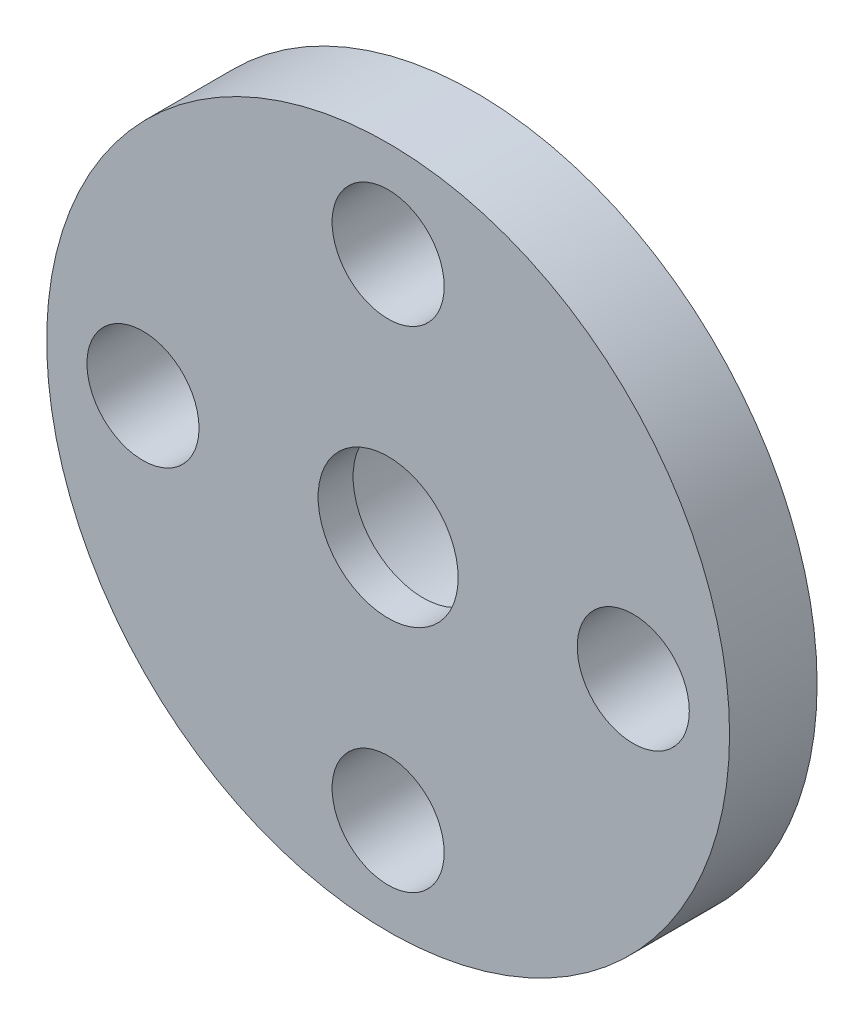
ISO-10303-21;
HEADER;
FILE_DESCRIPTION(('STEP AP214'),'2;1');
FILE_NAME('part.step','',(''),(''),'','','');
FILE_SCHEMA(('AUTOMOTIVE_DESIGN { 1 0 10303 214 1 1 1 1 }'));
ENDSEC;
DATA;
#1=APPLICATION_CONTEXT('core data for automotive mechanical design processes');
#2=APPLICATION_PROTOCOL_DEFINITION('international standard','automotive_design',2000,#1);
#3=PRODUCT_CONTEXT('',#1,'mechanical');
#4=PRODUCT('Part','Part','',(#3));
#5=PRODUCT_RELATED_PRODUCT_CATEGORY('part','',(#4));
#6=PRODUCT_DEFINITION_FORMATION('','',#4);
#7=PRODUCT_DEFINITION_CONTEXT('part definition',#1,'design');
#8=PRODUCT_DEFINITION('design','',#6,#7);
#9=PRODUCT_DEFINITION_SHAPE('','',#8);
#10=(LENGTH_UNIT() NAMED_UNIT(*) SI_UNIT(.MILLI.,.METRE.));
#11=(NAMED_UNIT(*) PLANE_ANGLE_UNIT() SI_UNIT($,.RADIAN.));
#12=(NAMED_UNIT(*) SI_UNIT($,.STERADIAN.) SOLID_ANGLE_UNIT());
#13=UNCERTAINTY_MEASURE_WITH_UNIT(LENGTH_MEASURE(1.E-05),#10,'distance_accuracy_value','');
#14=(GEOMETRIC_REPRESENTATION_CONTEXT(3) GLOBAL_UNCERTAINTY_ASSIGNED_CONTEXT((#13)) GLOBAL_UNIT_ASSIGNED_CONTEXT((#10,
#11,#12)) REPRESENTATION_CONTEXT('',''));
#15=CARTESIAN_POINT('',(0.,0.,0.));
#16=DIRECTION('',(0.,0.,1.));
#17=DIRECTION('',(1.,0.,0.));
#18=AXIS2_PLACEMENT_3D('',#15,#16,#17);
#19=CARTESIAN_POINT('',(0.,0.,2.5));
#20=DIRECTION('',(0.,0.,1.));
#21=DIRECTION('',(1.,0.,0.));
#22=AXIS2_PLACEMENT_3D('',#19,#20,#21);
#23=PLANE('',#22);
#24=CARTESIAN_POINT('',(0.,0.,2.5));
#25=DIRECTION('',(0.,0.,1.));
#26=DIRECTION('',(1.,0.,0.));
#27=AXIS2_PLACEMENT_3D('',#24,#25,#26);
#28=CIRCLE('',#27,2.);
#29=CARTESIAN_POINT('',(2.,0.,2.5));
#30=VERTEX_POINT('',#29);
#31=EDGE_CURVE('E206',#30,#30,#28,.T.);
#32=ORIENTED_EDGE('',*,*,#31,.F.);
#33=EDGE_LOOP('',(#32));
#34=FACE_BOUND('',#33,.T.);
#35=CARTESIAN_POINT('',(7.,0.,2.5));
#36=DIRECTION('',(0.,0.,1.));
#37=DIRECTION('',(1.,0.,0.));
#38=AXIS2_PLACEMENT_3D('',#35,#36,#37);
#39=CIRCLE('',#38,1.6);
#40=CARTESIAN_POINT('',(8.6,0.,2.5));
#41=VERTEX_POINT('',#40);
#42=EDGE_CURVE('E89',#41,#41,#39,.T.);
#43=ORIENTED_EDGE('',*,*,#42,.F.);
#44=EDGE_LOOP('',(#43));
#45=FACE_BOUND('',#44,.T.);
#46=CARTESIAN_POINT('',(-7.,0.,2.5));
#47=DIRECTION('',(0.,0.,1.));
#48=DIRECTION('',(1.,0.,0.));
#49=AXIS2_PLACEMENT_3D('',#46,#47,#48);
#50=CIRCLE('',#49,1.6);
#51=CARTESIAN_POINT('',(-5.4,0.,2.5));
#52=VERTEX_POINT('',#51);
#53=EDGE_CURVE('E101',#52,#52,#50,.T.);
#54=ORIENTED_EDGE('',*,*,#53,.F.);
#55=EDGE_LOOP('',(#54));
#56=FACE_BOUND('',#55,.T.);
#57=CARTESIAN_POINT('',(0.,0.,2.5));
#58=DIRECTION('',(0.,0.,1.));
#59=DIRECTION('',(1.,0.,0.));
#60=AXIS2_PLACEMENT_3D('',#57,#58,#59);
#61=CIRCLE('',#60,9.75);
#62=CARTESIAN_POINT('',(9.75,0.,2.5));
#63=VERTEX_POINT('',#62);
#64=EDGE_CURVE('E71',#63,#63,#61,.T.);
#65=ORIENTED_EDGE('',*,*,#64,.T.);
#66=EDGE_LOOP('',(#65));
#67=FACE_BOUND('',#66,.T.);
#68=CARTESIAN_POINT('',(0.,7.,2.5));
#69=DIRECTION('',(0.,0.,1.));
#70=DIRECTION('',(1.,0.,0.));
#71=AXIS2_PLACEMENT_3D('',#68,#69,#70);
#72=CIRCLE('',#71,1.6);
#73=CARTESIAN_POINT('',(1.6,7.,2.5));
#74=VERTEX_POINT('',#73);
#75=EDGE_CURVE('E95',#74,#74,#72,.T.);
#76=ORIENTED_EDGE('',*,*,#75,.F.);
#77=EDGE_LOOP('',(#76));
#78=FACE_BOUND('',#77,.T.);
#79=CARTESIAN_POINT('',(0.,-7.,2.5));
#80=DIRECTION('',(0.,0.,1.));
#81=DIRECTION('',(1.,0.,0.));
#82=AXIS2_PLACEMENT_3D('',#79,#80,#81);
#83=CIRCLE('',#82,1.6);
#84=CARTESIAN_POINT('',(1.6,-7.,2.5));
#85=VERTEX_POINT('',#84);
#86=EDGE_CURVE('E82',#85,#85,#83,.T.);
#87=ORIENTED_EDGE('',*,*,#86,.F.);
#88=EDGE_LOOP('',(#87));
#89=FACE_BOUND('',#88,.T.);
#90=ADVANCED_FACE('F63',(#34,#45,#56,#67,#78,#89),#23,.T.);
#91=CARTESIAN_POINT('',(0.,0.,0.));
#92=DIRECTION('',(0.,0.,1.));
#93=DIRECTION('',(1.,0.,0.));
#94=AXIS2_PLACEMENT_3D('',#91,#92,#93);
#95=PLANE('',#94);
#96=CARTESIAN_POINT('',(0.,0.,0.));
#97=DIRECTION('',(0.,0.,-1.));
#98=DIRECTION('',(-1.,0.,0.));
#99=AXIS2_PLACEMENT_3D('',#96,#97,#98);
#100=CIRCLE('',#99,4.);
#101=CARTESIAN_POINT('',(-4.,0.,0.));
#102=VERTEX_POINT('',#101);
#103=EDGE_CURVE('E12',#102,#102,#100,.T.);
#104=ORIENTED_EDGE('',*,*,#103,.F.);
#105=EDGE_LOOP('',(#104));
#106=FACE_BOUND('',#105,.T.);
#107=CARTESIAN_POINT('',(0.,0.,0.));
#108=DIRECTION('',(0.,0.,1.));
#109=DIRECTION('',(1.,0.,0.));
#110=AXIS2_PLACEMENT_3D('',#107,#108,#109);
#111=CIRCLE('',#110,9.75);
#112=CARTESIAN_POINT('',(9.75,0.,0.));
#113=VERTEX_POINT('',#112);
#114=EDGE_CURVE('E76',#113,#113,#111,.T.);
#115=ORIENTED_EDGE('',*,*,#114,.F.);
#116=EDGE_LOOP('',(#115));
#117=FACE_BOUND('',#116,.T.);
#118=CARTESIAN_POINT('',(-7.,0.,0.));
#119=DIRECTION('',(0.,0.,1.));
#120=DIRECTION('',(1.,0.,0.));
#121=AXIS2_PLACEMENT_3D('',#118,#119,#120);
#122=CIRCLE('',#121,1.6);
#123=CARTESIAN_POINT('',(-5.4,0.,0.));
#124=VERTEX_POINT('',#123);
#125=EDGE_CURVE('E98',#124,#124,#122,.T.);
#126=ORIENTED_EDGE('',*,*,#125,.T.);
#127=EDGE_LOOP('',(#126));
#128=FACE_BOUND('',#127,.T.);
#129=CARTESIAN_POINT('',(0.,7.,0.));
#130=DIRECTION('',(0.,0.,1.));
#131=DIRECTION('',(1.,0.,0.));
#132=AXIS2_PLACEMENT_3D('',#129,#130,#131);
#133=CIRCLE('',#132,1.6);
#134=CARTESIAN_POINT('',(1.6,7.,0.));
#135=VERTEX_POINT('',#134);
#136=EDGE_CURVE('E92',#135,#135,#133,.T.);
#137=ORIENTED_EDGE('',*,*,#136,.T.);
#138=EDGE_LOOP('',(#137));
#139=FACE_BOUND('',#138,.T.);
#140=CARTESIAN_POINT('',(7.,0.,0.));
#141=DIRECTION('',(0.,0.,1.));
#142=DIRECTION('',(1.,0.,0.));
#143=AXIS2_PLACEMENT_3D('',#140,#141,#142);
#144=CIRCLE('',#143,1.6);
#145=CARTESIAN_POINT('',(8.6,0.,0.));
#146=VERTEX_POINT('',#145);
#147=EDGE_CURVE('E85',#146,#146,#144,.T.);
#148=ORIENTED_EDGE('',*,*,#147,.T.);
#149=EDGE_LOOP('',(#148));
#150=FACE_BOUND('',#149,.T.);
#151=CARTESIAN_POINT('',(0.,-7.,0.));
#152=DIRECTION('',(0.,0.,1.));
#153=DIRECTION('',(1.,0.,0.));
#154=AXIS2_PLACEMENT_3D('',#151,#152,#153);
#155=CIRCLE('',#154,1.6);
#156=CARTESIAN_POINT('',(1.6,-7.,0.));
#157=VERTEX_POINT('',#156);
#158=EDGE_CURVE('E86',#157,#157,#155,.T.);
#159=ORIENTED_EDGE('',*,*,#158,.T.);
#160=EDGE_LOOP('',(#159));
#161=FACE_BOUND('',#160,.T.);
#162=ADVANCED_FACE('F109',(#106,#117,#128,#139,#150,#161),#95,.F.);
#163=CARTESIAN_POINT('',(0.,0.,2.5));
#164=DIRECTION('',(0.,0.,-1.));
#165=DIRECTION('',(-1.,0.,0.));
#166=AXIS2_PLACEMENT_3D('',#163,#164,#165);
#167=CYLINDRICAL_SURFACE('',#166,9.75);
#168=ORIENTED_EDGE('',*,*,#64,.F.);
#169=EDGE_LOOP('',(#168));
#170=FACE_BOUND('',#169,.T.);
#171=ORIENTED_EDGE('',*,*,#114,.T.);
#172=EDGE_LOOP('',(#171));
#173=FACE_BOUND('',#172,.T.);
#174=ADVANCED_FACE('F65',(#170,#173),#167,.T.);
#175=CARTESIAN_POINT('',(-7.,0.,2.5));
#176=DIRECTION('',(0.,0.,-1.));
#177=DIRECTION('',(-1.,0.,0.));
#178=AXIS2_PLACEMENT_3D('',#175,#176,#177);
#179=CYLINDRICAL_SURFACE('',#178,1.6);
#180=ORIENTED_EDGE('',*,*,#53,.T.);
#181=EDGE_LOOP('',(#180));
#182=FACE_BOUND('',#181,.T.);
#183=ORIENTED_EDGE('',*,*,#125,.F.);
#184=EDGE_LOOP('',(#183));
#185=FACE_BOUND('',#184,.T.);
#186=ADVANCED_FACE('F147',(#182,#185),#179,.F.);
#187=CARTESIAN_POINT('',(0.,7.,2.5));
#188=DIRECTION('',(0.,0.,-1.));
#189=DIRECTION('',(-1.,0.,0.));
#190=AXIS2_PLACEMENT_3D('',#187,#188,#189);
#191=CYLINDRICAL_SURFACE('',#190,1.6);
#192=ORIENTED_EDGE('',*,*,#75,.T.);
#193=EDGE_LOOP('',(#192));
#194=FACE_BOUND('',#193,.T.);
#195=ORIENTED_EDGE('',*,*,#136,.F.);
#196=EDGE_LOOP('',(#195));
#197=FACE_BOUND('',#196,.T.);
#198=ADVANCED_FACE('F134',(#194,#197),#191,.F.);
#199=CARTESIAN_POINT('',(7.,0.,2.5));
#200=DIRECTION('',(0.,0.,-1.));
#201=DIRECTION('',(-1.,0.,0.));
#202=AXIS2_PLACEMENT_3D('',#199,#200,#201);
#203=CYLINDRICAL_SURFACE('',#202,1.6);
#204=ORIENTED_EDGE('',*,*,#42,.T.);
#205=EDGE_LOOP('',(#204));
#206=FACE_BOUND('',#205,.T.);
#207=ORIENTED_EDGE('',*,*,#147,.F.);
#208=EDGE_LOOP('',(#207));
#209=FACE_BOUND('',#208,.T.);
#210=ADVANCED_FACE('F124',(#206,#209),#203,.F.);
#211=CARTESIAN_POINT('',(0.,-7.,2.5));
#212=DIRECTION('',(0.,0.,-1.));
#213=DIRECTION('',(-1.,0.,0.));
#214=AXIS2_PLACEMENT_3D('',#211,#212,#213);
#215=CYLINDRICAL_SURFACE('',#214,1.6);
#216=ORIENTED_EDGE('',*,*,#86,.T.);
#217=EDGE_LOOP('',(#216));
#218=FACE_BOUND('',#217,.T.);
#219=ORIENTED_EDGE('',*,*,#158,.F.);
#220=EDGE_LOOP('',(#219));
#221=FACE_BOUND('',#220,.T.);
#222=ADVANCED_FACE('F121',(#218,#221),#215,.F.);
#223=CARTESIAN_POINT('',(0.,0.,-3.));
#224=DIRECTION('',(0.,0.,1.));
#225=DIRECTION('',(1.,0.,0.));
#226=AXIS2_PLACEMENT_3D('',#223,#224,#225);
#227=CYLINDRICAL_SURFACE('',#226,4.);
#228=CARTESIAN_POINT('',(0.,0.,-3.));
#229=DIRECTION('',(0.,0.,-1.));
#230=DIRECTION('',(-1.,0.,0.));
#231=AXIS2_PLACEMENT_3D('',#228,#229,#230);
#232=CIRCLE('',#231,4.);
#233=CARTESIAN_POINT('',(-4.,0.,-3.));
#234=VERTEX_POINT('',#233);
#235=EDGE_CURVE('E80',#234,#234,#232,.T.);
#236=ORIENTED_EDGE('',*,*,#235,.F.);
#237=EDGE_LOOP('',(#236));
#238=FACE_BOUND('',#237,.T.);
#239=ORIENTED_EDGE('',*,*,#103,.T.);
#240=EDGE_LOOP('',(#239));
#241=FACE_BOUND('',#240,.T.);
#242=ADVANCED_FACE('F123',(#238,#241),#227,.T.);
#243=CARTESIAN_POINT('',(0.,0.,-3.));
#244=DIRECTION('',(0.,0.,-1.));
#245=DIRECTION('',(-1.,0.,0.));
#246=AXIS2_PLACEMENT_3D('',#243,#244,#245);
#247=PLANE('',#246);
#248=CARTESIAN_POINT('',(0.,0.,-3.));
#249=DIRECTION('',(0.,0.,-1.));
#250=DIRECTION('',(-1.,0.,0.));
#251=AXIS2_PLACEMENT_3D('',#248,#249,#250);
#252=CIRCLE('',#251,3.);
#253=CARTESIAN_POINT('',(-3.,0.,-3.));
#254=VERTEX_POINT('',#253);
#255=EDGE_CURVE('E209',#254,#254,#252,.T.);
#256=ORIENTED_EDGE('',*,*,#255,.F.);
#257=EDGE_LOOP('',(#256));
#258=FACE_BOUND('',#257,.T.);
#259=ORIENTED_EDGE('',*,*,#235,.T.);
#260=EDGE_LOOP('',(#259));
#261=FACE_BOUND('',#260,.T.);
#262=ADVANCED_FACE('F131',(#258,#261),#247,.T.);
#263=CARTESIAN_POINT('',(0.,0.,1.5));
#264=DIRECTION('',(0.,0.,1.));
#265=DIRECTION('',(1.,0.,0.));
#266=AXIS2_PLACEMENT_3D('',#263,#264,#265);
#267=PLANE('',#266);
#268=CARTESIAN_POINT('',(0.,0.,1.5));
#269=DIRECTION('',(0.,0.,1.));
#270=DIRECTION('',(1.,0.,0.));
#271=AXIS2_PLACEMENT_3D('',#268,#269,#270);
#272=CIRCLE('',#271,2.);
#273=CARTESIAN_POINT('',(2.,0.,1.5));
#274=VERTEX_POINT('',#273);
#275=EDGE_CURVE('E67',#274,#274,#272,.T.);
#276=ORIENTED_EDGE('',*,*,#275,.T.);
#277=EDGE_LOOP('',(#276));
#278=FACE_BOUND('',#277,.T.);
#279=CARTESIAN_POINT('',(0.,0.,1.5));
#280=DIRECTION('',(0.,0.,1.));
#281=DIRECTION('',(1.,0.,0.));
#282=AXIS2_PLACEMENT_3D('',#279,#280,#281);
#283=CIRCLE('',#282,3.);
#284=CARTESIAN_POINT('',(-3.,0.,1.5));
#285=VERTEX_POINT('',#284);
#286=EDGE_CURVE('E211',#285,#285,#283,.F.);
#287=ORIENTED_EDGE('',*,*,#286,.T.);
#288=EDGE_LOOP('',(#287));
#289=FACE_BOUND('',#288,.T.);
#290=ADVANCED_FACE('F180',(#278,#289),#267,.F.);
#291=CARTESIAN_POINT('',(0.,0.,10.9852813742386));
#292=DIRECTION('',(0.,0.,-1.));
#293=DIRECTION('',(-1.,0.,0.));
#294=AXIS2_PLACEMENT_3D('',#291,#292,#293);
#295=CYLINDRICAL_SURFACE('',#294,3.);
#296=CARTESIAN_POINT('',(-3.,0.,-3.));
#297=CARTESIAN_POINT('',(-3.,0.,-2.953125));
#298=CARTESIAN_POINT('',(-3.,0.,-2.90625));
#299=CARTESIAN_POINT('',(-3.,0.,-2.8125));
#300=CARTESIAN_POINT('',(-3.,0.,-2.765625));
#301=CARTESIAN_POINT('',(-3.,0.,-2.671875));
#302=CARTESIAN_POINT('',(-3.,0.,-2.625));
#303=CARTESIAN_POINT('',(-3.,0.,-2.53125));
#304=CARTESIAN_POINT('',(-3.,0.,-2.484375));
#305=CARTESIAN_POINT('',(-3.,0.,-2.390625));
#306=CARTESIAN_POINT('',(-3.,0.,-2.34375));
#307=CARTESIAN_POINT('',(-3.,0.,-2.25));
#308=CARTESIAN_POINT('',(-3.,0.,-2.203125));
#309=CARTESIAN_POINT('',(-3.,0.,-2.109375));
#310=CARTESIAN_POINT('',(-3.,0.,-2.0625));
#311=CARTESIAN_POINT('',(-3.,0.,-1.96875));
#312=CARTESIAN_POINT('',(-3.,0.,-1.921875));
#313=CARTESIAN_POINT('',(-3.,0.,-1.828125));
#314=CARTESIAN_POINT('',(-3.,0.,-1.78125));
#315=CARTESIAN_POINT('',(-3.,0.,-1.6875));
#316=CARTESIAN_POINT('',(-3.,0.,-1.640625));
#317=CARTESIAN_POINT('',(-3.,0.,-1.546875));
#318=CARTESIAN_POINT('',(-3.,0.,-1.5));
#319=CARTESIAN_POINT('',(-3.,0.,-1.40625));
#320=CARTESIAN_POINT('',(-3.,0.,-1.359375));
#321=CARTESIAN_POINT('',(-3.,0.,-1.265625));
#322=CARTESIAN_POINT('',(-3.,0.,-1.21875));
#323=CARTESIAN_POINT('',(-3.,0.,-1.125));
#324=CARTESIAN_POINT('',(-3.,0.,-1.078125));
#325=CARTESIAN_POINT('',(-3.,0.,-0.984375000000001));
#326=CARTESIAN_POINT('',(-3.,0.,-0.937500000000001));
#327=CARTESIAN_POINT('',(-3.,0.,-0.843750000000001));
#328=CARTESIAN_POINT('',(-3.,0.,-0.796875000000001));
#329=CARTESIAN_POINT('',(-3.,0.,-0.703125000000001));
#330=CARTESIAN_POINT('',(-3.,0.,-0.656250000000001));
#331=CARTESIAN_POINT('',(-3.,0.,-0.5625));
#332=CARTESIAN_POINT('',(-3.,0.,-0.515625));
#333=CARTESIAN_POINT('',(-3.,0.,-0.421875));
#334=CARTESIAN_POINT('',(-3.,0.,-0.375));
#335=CARTESIAN_POINT('',(-3.,0.,-0.28125));
#336=CARTESIAN_POINT('',(-3.,0.,-0.234375));
#337=CARTESIAN_POINT('',(-3.,0.,-0.140625));
#338=CARTESIAN_POINT('',(-3.,0.,-0.0937500000000001));
#339=CARTESIAN_POINT('',(-3.,0.,0.));
#340=CARTESIAN_POINT('',(-3.,0.,0.0468749999999989));
#341=CARTESIAN_POINT('',(-3.,0.,0.140624999999999));
#342=CARTESIAN_POINT('',(-3.,0.,0.1875));
#343=CARTESIAN_POINT('',(-3.,0.,0.28125));
#344=CARTESIAN_POINT('',(-3.,0.,0.328124999999999));
#345=CARTESIAN_POINT('',(-3.,0.,0.421874999999999));
#346=CARTESIAN_POINT('',(-3.,0.,0.46875));
#347=CARTESIAN_POINT('',(-3.,0.,0.5625));
#348=CARTESIAN_POINT('',(-3.,0.,0.609374999999999));
#349=CARTESIAN_POINT('',(-3.,0.,0.703124999999999));
#350=CARTESIAN_POINT('',(-3.,0.,0.749999999999999));
#351=CARTESIAN_POINT('',(-3.,0.,0.843749999999999));
#352=CARTESIAN_POINT('',(-3.,0.,0.890624999999999));
#353=CARTESIAN_POINT('',(-3.,0.,0.984374999999999));
#354=CARTESIAN_POINT('',(-3.,0.,1.03125));
#355=CARTESIAN_POINT('',(-3.,0.,1.125));
#356=CARTESIAN_POINT('',(-3.,0.,1.171875));
#357=CARTESIAN_POINT('',(-3.,0.,1.265625));
#358=CARTESIAN_POINT('',(-3.,0.,1.3125));
#359=CARTESIAN_POINT('',(-3.,0.,1.40625));
#360=CARTESIAN_POINT('',(-3.,0.,1.453125));
#361=CARTESIAN_POINT('',(-3.,0.,1.5));
#362=B_SPLINE_CURVE_WITH_KNOTS('',3,(#296,#297,#298,#299,#300,#301,#302,#303,#304,#305,#306,
#307,#308,#309,#310,#311,#312,#313,#314,#315,#316,#317,#318,#319,#320,#321,#322,#323,#324,#325,
#326,#327,#328,#329,#330,#331,#332,#333,#334,#335,#336,#337,#338,#339,#340,#341,#342,#343,#344,
#345,#346,#347,#348,#349,#350,#351,#352,#353,#354,#355,#356,#357,#358,#359,#360,#361),
.UNSPECIFIED.,.F.,.F.,(4,2,2,2,2,2,2,2,2,2,2,2,2,2,2,2,2,2,2,2,2,2,2,2,2,2,2,2,2,2,2,2,4),(0.,
0.140625,0.28125,0.421875,0.5625,0.703125000000001,0.843750000000001,0.984374999999999,1.125,
1.265625,1.40625,1.546875,1.6875,1.828125,1.96875,2.109375,2.25,2.390625,2.53125,2.671875,
2.8125,2.953125,3.09375,3.234375,3.375,3.515625,3.65625,3.796875,3.9375,4.078125,4.21875,
4.359375,4.5),.UNSPECIFIED.);
#363=EDGE_CURVE('BSEAM187',#254,#285,#362,.T.);
#364=ORIENTED_EDGE('',*,*,#255,.T.);
#365=ORIENTED_EDGE('',*,*,#286,.F.);
#366=ORIENTED_EDGE('',*,*,#363,.T.);
#367=ORIENTED_EDGE('',*,*,#363,.F.);
#368=EDGE_LOOP('',(#364,#366,#365,#367));
#369=FACE_BOUND('',#368,.T.);
#370=ADVANCED_FACE('F187',(#369),#295,.F.);
#371=CARTESIAN_POINT('',(0.,0.,0.));
#372=DIRECTION('',(0.,0.,1.));
#373=DIRECTION('',(1.,0.,0.));
#374=AXIS2_PLACEMENT_3D('',#371,#372,#373);
#375=CYLINDRICAL_SURFACE('',#374,2.);
#376=ORIENTED_EDGE('',*,*,#31,.T.);
#377=EDGE_LOOP('',(#376));
#378=FACE_BOUND('',#377,.T.);
#379=ORIENTED_EDGE('',*,*,#275,.F.);
#380=EDGE_LOOP('',(#379));
#381=FACE_BOUND('',#380,.T.);
#382=ADVANCED_FACE('F195',(#378,#381),#375,.F.);
#383=CLOSED_SHELL('',(#90,#162,#174,#186,#198,#210,#222,#242,#262,#290,#370,#382));
#384=MANIFOLD_SOLID_BREP('B2',#383);
#385=ADVANCED_BREP_SHAPE_REPRESENTATION('',(#18,#384),#14);
#386=SHAPE_DEFINITION_REPRESENTATION(#9,#385);
ENDSEC;
END-ISO-10303-21;
